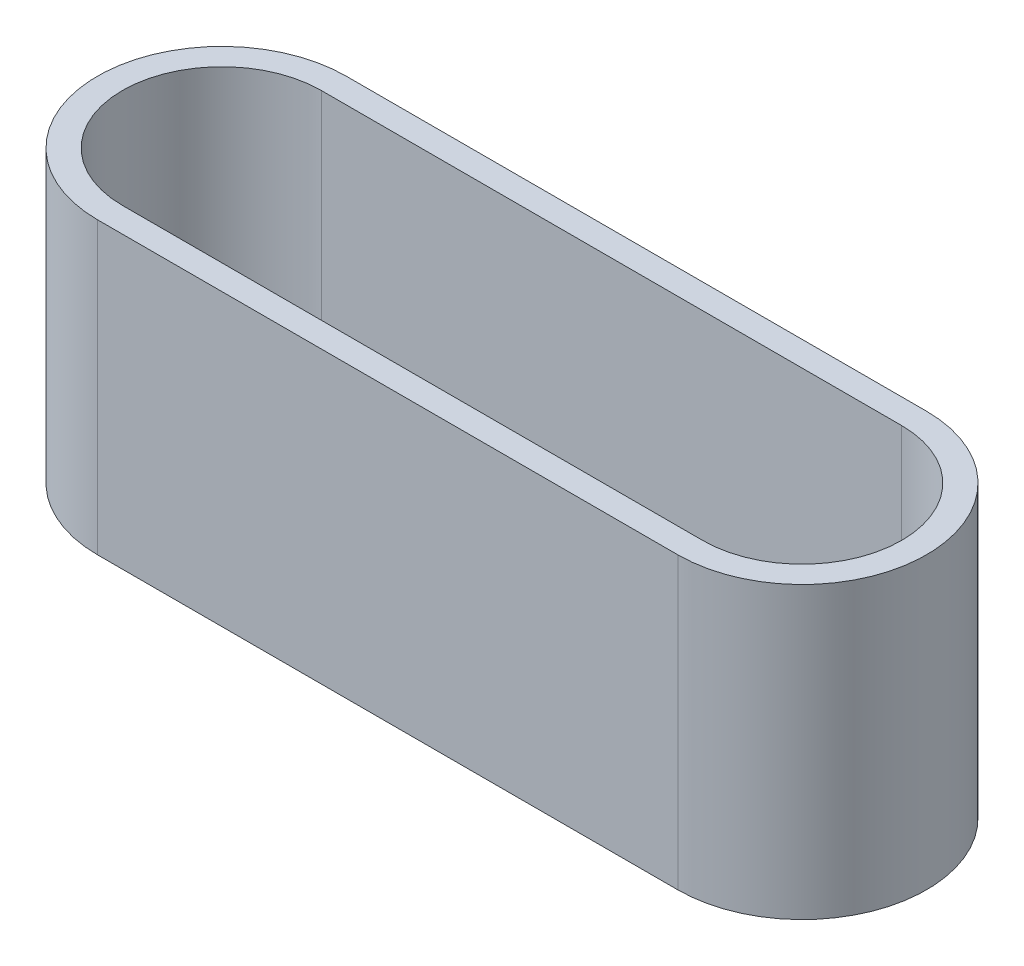
ISO-10303-21;
HEADER;
FILE_DESCRIPTION(('STEP AP214'),'2;1');
FILE_NAME('part.step','',(''),(''),'','','');
FILE_SCHEMA(('AUTOMOTIVE_DESIGN { 1 0 10303 214 1 1 1 1 }'));
ENDSEC;
DATA;
#1=APPLICATION_CONTEXT('core data for automotive mechanical design processes');
#2=APPLICATION_PROTOCOL_DEFINITION('international standard','automotive_design',2000,#1);
#3=PRODUCT_CONTEXT('',#1,'mechanical');
#4=PRODUCT('Part','Part','',(#3));
#5=PRODUCT_RELATED_PRODUCT_CATEGORY('part','',(#4));
#6=PRODUCT_DEFINITION_FORMATION('','',#4);
#7=PRODUCT_DEFINITION_CONTEXT('part definition',#1,'design');
#8=PRODUCT_DEFINITION('design','',#6,#7);
#9=PRODUCT_DEFINITION_SHAPE('','',#8);
#10=(LENGTH_UNIT() NAMED_UNIT(*) SI_UNIT(.MILLI.,.METRE.));
#11=(NAMED_UNIT(*) PLANE_ANGLE_UNIT() SI_UNIT($,.RADIAN.));
#12=(NAMED_UNIT(*) SI_UNIT($,.STERADIAN.) SOLID_ANGLE_UNIT());
#13=UNCERTAINTY_MEASURE_WITH_UNIT(LENGTH_MEASURE(1.E-05),#10,'distance_accuracy_value','');
#14=(GEOMETRIC_REPRESENTATION_CONTEXT(3) GLOBAL_UNCERTAINTY_ASSIGNED_CONTEXT((#13)) GLOBAL_UNIT_ASSIGNED_CONTEXT((#10,
#11,#12)) REPRESENTATION_CONTEXT('',''));
#15=CARTESIAN_POINT('',(0.,0.,0.));
#16=DIRECTION('',(0.,0.,1.));
#17=DIRECTION('',(1.,0.,0.));
#18=AXIS2_PLACEMENT_3D('',#15,#16,#17);
#19=CARTESIAN_POINT('',(-35.,35.,0.));
#20=DIRECTION('',(0.,1.,0.));
#21=DIRECTION('',(0.,0.,1.));
#22=AXIS2_PLACEMENT_3D('',#19,#20,#21);
#23=PLANE('',#22);
#24=CARTESIAN_POINT('',(-35.,35.,0.));
#25=DIRECTION('',(0.,1.,0.));
#26=DIRECTION('',(0.,0.,1.));
#27=AXIS2_PLACEMENT_3D('',#24,#25,#26);
#28=CIRCLE('',#27,15.);
#29=CARTESIAN_POINT('',(-35.,35.,-15.));
#30=VERTEX_POINT('',#29);
#31=CARTESIAN_POINT('',(-35.,35.,15.));
#32=VERTEX_POINT('',#31);
#33=EDGE_CURVE('E133',#30,#32,#28,.T.);
#34=ORIENTED_EDGE('',*,*,#33,.T.);
#35=DIRECTION('',(1.,0.,0.));
#36=VECTOR('',#35,1.);
#37=CARTESIAN_POINT('',(-35.,35.,15.));
#38=LINE('',#37,#36);
#39=CARTESIAN_POINT('',(35.,35.,15.));
#40=VERTEX_POINT('',#39);
#41=EDGE_CURVE('E136',#32,#40,#38,.T.);
#42=ORIENTED_EDGE('',*,*,#41,.T.);
#43=CARTESIAN_POINT('',(35.,35.,0.));
#44=DIRECTION('',(0.,1.,0.));
#45=DIRECTION('',(0.,0.,1.));
#46=AXIS2_PLACEMENT_3D('',#43,#44,#45);
#47=CIRCLE('',#46,15.);
#48=CARTESIAN_POINT('',(35.,35.,-15.));
#49=VERTEX_POINT('',#48);
#50=EDGE_CURVE('E139',#40,#49,#47,.T.);
#51=ORIENTED_EDGE('',*,*,#50,.T.);
#52=DIRECTION('',(-1.,0.,0.));
#53=VECTOR('',#52,1.);
#54=CARTESIAN_POINT('',(-35.,35.,-15.));
#55=LINE('',#54,#53);
#56=EDGE_CURVE('E141',#49,#30,#55,.T.);
#57=ORIENTED_EDGE('',*,*,#56,.T.);
#58=EDGE_LOOP('',(#34,#42,#51,#57));
#59=FACE_BOUND('',#58,.T.);
#60=DIRECTION('',(1.,0.,0.));
#61=VECTOR('',#60,1.);
#62=CARTESIAN_POINT('',(-35.,35.,12.));
#63=LINE('',#62,#61);
#64=CARTESIAN_POINT('',(-35.,35.,12.));
#65=VERTEX_POINT('',#64);
#66=CARTESIAN_POINT('',(35.,35.,12.));
#67=VERTEX_POINT('',#66);
#68=EDGE_CURVE('E105',#65,#67,#63,.T.);
#69=ORIENTED_EDGE('',*,*,#68,.F.);
#70=CARTESIAN_POINT('',(-35.,35.,0.));
#71=DIRECTION('',(0.,1.,0.));
#72=DIRECTION('',(0.,0.,1.));
#73=AXIS2_PLACEMENT_3D('',#70,#71,#72);
#74=CIRCLE('',#73,12.);
#75=CARTESIAN_POINT('',(-35.,35.,-12.));
#76=VERTEX_POINT('',#75);
#77=EDGE_CURVE('E97',#76,#65,#74,.T.);
#78=ORIENTED_EDGE('',*,*,#77,.F.);
#79=DIRECTION('',(-1.,0.,0.));
#80=VECTOR('',#79,1.);
#81=CARTESIAN_POINT('',(-35.,35.,-12.));
#82=LINE('',#81,#80);
#83=CARTESIAN_POINT('',(35.,35.,-12.));
#84=VERTEX_POINT('',#83);
#85=EDGE_CURVE('E119',#84,#76,#82,.T.);
#86=ORIENTED_EDGE('',*,*,#85,.F.);
#87=CARTESIAN_POINT('',(35.,35.,0.));
#88=DIRECTION('',(0.,1.,0.));
#89=DIRECTION('',(0.,0.,1.));
#90=AXIS2_PLACEMENT_3D('',#87,#88,#89);
#91=CIRCLE('',#90,12.);
#92=EDGE_CURVE('E117',#67,#84,#91,.T.);
#93=ORIENTED_EDGE('',*,*,#92,.F.);
#94=EDGE_LOOP('',(#69,#78,#86,#93));
#95=FACE_BOUND('',#94,.T.);
#96=ADVANCED_FACE('F32',(#59,#95),#23,.T.);
#97=CARTESIAN_POINT('',(-35.,0.,0.));
#98=DIRECTION('',(0.,1.,0.));
#99=DIRECTION('',(0.,0.,1.));
#100=AXIS2_PLACEMENT_3D('',#97,#98,#99);
#101=PLANE('',#100);
#102=CARTESIAN_POINT('',(-35.,0.,0.));
#103=DIRECTION('',(0.,1.,0.));
#104=DIRECTION('',(0.,0.,1.));
#105=AXIS2_PLACEMENT_3D('',#102,#103,#104);
#106=CIRCLE('',#105,15.);
#107=CARTESIAN_POINT('',(-35.,0.,-15.));
#108=VERTEX_POINT('',#107);
#109=CARTESIAN_POINT('',(-35.,0.,15.));
#110=VERTEX_POINT('',#109);
#111=EDGE_CURVE('E113',#108,#110,#106,.T.);
#112=ORIENTED_EDGE('',*,*,#111,.F.);
#113=DIRECTION('',(-1.,0.,0.));
#114=VECTOR('',#113,1.);
#115=CARTESIAN_POINT('',(-35.,0.,-15.));
#116=LINE('',#115,#114);
#117=CARTESIAN_POINT('',(35.,0.,-15.));
#118=VERTEX_POINT('',#117);
#119=EDGE_CURVE('E137',#118,#108,#116,.T.);
#120=ORIENTED_EDGE('',*,*,#119,.F.);
#121=CARTESIAN_POINT('',(35.,0.,0.));
#122=DIRECTION('',(0.,1.,0.));
#123=DIRECTION('',(0.,0.,1.));
#124=AXIS2_PLACEMENT_3D('',#121,#122,#123);
#125=CIRCLE('',#124,15.);
#126=CARTESIAN_POINT('',(35.,0.,15.));
#127=VERTEX_POINT('',#126);
#128=EDGE_CURVE('E148',#127,#118,#125,.T.);
#129=ORIENTED_EDGE('',*,*,#128,.F.);
#130=DIRECTION('',(1.,0.,0.));
#131=VECTOR('',#130,1.);
#132=CARTESIAN_POINT('',(-35.,0.,15.));
#133=LINE('',#132,#131);
#134=EDGE_CURVE('E146',#110,#127,#133,.T.);
#135=ORIENTED_EDGE('',*,*,#134,.F.);
#136=EDGE_LOOP('',(#112,#120,#129,#135));
#137=FACE_BOUND('',#136,.T.);
#138=CARTESIAN_POINT('',(-35.,0.,0.));
#139=DIRECTION('',(0.,1.,0.));
#140=DIRECTION('',(0.,0.,1.));
#141=AXIS2_PLACEMENT_3D('',#138,#139,#140);
#142=CIRCLE('',#141,12.);
#143=CARTESIAN_POINT('',(-35.,0.,-12.));
#144=VERTEX_POINT('',#143);
#145=CARTESIAN_POINT('',(-35.,0.,12.));
#146=VERTEX_POINT('',#145);
#147=EDGE_CURVE('E55',#144,#146,#142,.T.);
#148=ORIENTED_EDGE('',*,*,#147,.T.);
#149=DIRECTION('',(1.,0.,0.));
#150=VECTOR('',#149,1.);
#151=CARTESIAN_POINT('',(-35.,0.,12.));
#152=LINE('',#151,#150);
#153=CARTESIAN_POINT('',(35.,0.,12.));
#154=VERTEX_POINT('',#153);
#155=EDGE_CURVE('E112',#146,#154,#152,.T.);
#156=ORIENTED_EDGE('',*,*,#155,.T.);
#157=CARTESIAN_POINT('',(35.,0.,0.));
#158=DIRECTION('',(0.,1.,0.));
#159=DIRECTION('',(0.,0.,1.));
#160=AXIS2_PLACEMENT_3D('',#157,#158,#159);
#161=CIRCLE('',#160,12.);
#162=CARTESIAN_POINT('',(35.,0.,-12.));
#163=VERTEX_POINT('',#162);
#164=EDGE_CURVE('E125',#154,#163,#161,.T.);
#165=ORIENTED_EDGE('',*,*,#164,.T.);
#166=DIRECTION('',(-1.,0.,0.));
#167=VECTOR('',#166,1.);
#168=CARTESIAN_POINT('',(-35.,0.,-12.));
#169=LINE('',#168,#167);
#170=EDGE_CURVE('E106',#163,#144,#169,.T.);
#171=ORIENTED_EDGE('',*,*,#170,.T.);
#172=EDGE_LOOP('',(#148,#156,#165,#171));
#173=FACE_BOUND('',#172,.T.);
#174=ADVANCED_FACE('F166',(#137,#173),#101,.F.);
#175=CARTESIAN_POINT('',(-35.,35.,0.));
#176=DIRECTION('',(0.,-1.,0.));
#177=DIRECTION('',(0.,0.,-1.));
#178=AXIS2_PLACEMENT_3D('',#175,#176,#177);
#179=CYLINDRICAL_SURFACE('',#178,15.);
#180=ORIENTED_EDGE('',*,*,#111,.T.);
#181=DIRECTION('',(0.,-1.,0.));
#182=VECTOR('',#181,1.);
#183=CARTESIAN_POINT('',(-35.,35.,15.));
#184=LINE('',#183,#182);
#185=EDGE_CURVE('E11',#32,#110,#184,.T.);
#186=ORIENTED_EDGE('',*,*,#185,.F.);
#187=ORIENTED_EDGE('',*,*,#33,.F.);
#188=DIRECTION('',(0.,-1.,0.));
#189=VECTOR('',#188,1.);
#190=CARTESIAN_POINT('',(-35.,35.,-15.));
#191=LINE('',#190,#189);
#192=EDGE_CURVE('E143',#30,#108,#191,.T.);
#193=ORIENTED_EDGE('',*,*,#192,.T.);
#194=EDGE_LOOP('',(#180,#186,#187,#193));
#195=FACE_BOUND('',#194,.T.);
#196=ADVANCED_FACE('F34',(#195),#179,.T.);
#197=CARTESIAN_POINT('',(-35.,35.,15.));
#198=DIRECTION('',(0.,0.,-1.));
#199=DIRECTION('',(-1.,0.,0.));
#200=AXIS2_PLACEMENT_3D('',#197,#198,#199);
#201=PLANE('',#200);
#202=ORIENTED_EDGE('',*,*,#134,.T.);
#203=DIRECTION('',(0.,-1.,0.));
#204=VECTOR('',#203,1.);
#205=CARTESIAN_POINT('',(35.,35.,15.));
#206=LINE('',#205,#204);
#207=EDGE_CURVE('E40',#40,#127,#206,.T.);
#208=ORIENTED_EDGE('',*,*,#207,.F.);
#209=ORIENTED_EDGE('',*,*,#41,.F.);
#210=ORIENTED_EDGE('',*,*,#185,.T.);
#211=EDGE_LOOP('',(#202,#208,#209,#210));
#212=FACE_BOUND('',#211,.T.);
#213=ADVANCED_FACE('F176',(#212),#201,.F.);
#214=CARTESIAN_POINT('',(35.,35.,0.));
#215=DIRECTION('',(0.,-1.,0.));
#216=DIRECTION('',(0.,0.,-1.));
#217=AXIS2_PLACEMENT_3D('',#214,#215,#216);
#218=CYLINDRICAL_SURFACE('',#217,15.);
#219=ORIENTED_EDGE('',*,*,#128,.T.);
#220=DIRECTION('',(0.,-1.,0.));
#221=VECTOR('',#220,1.);
#222=CARTESIAN_POINT('',(35.,35.,-15.));
#223=LINE('',#222,#221);
#224=EDGE_CURVE('E153',#49,#118,#223,.T.);
#225=ORIENTED_EDGE('',*,*,#224,.F.);
#226=ORIENTED_EDGE('',*,*,#50,.F.);
#227=ORIENTED_EDGE('',*,*,#207,.T.);
#228=EDGE_LOOP('',(#219,#225,#226,#227));
#229=FACE_BOUND('',#228,.T.);
#230=ADVANCED_FACE('F160',(#229),#218,.T.);
#231=CARTESIAN_POINT('',(-35.,35.,-15.));
#232=DIRECTION('',(0.,0.,1.));
#233=DIRECTION('',(1.,0.,0.));
#234=AXIS2_PLACEMENT_3D('',#231,#232,#233);
#235=PLANE('',#234);
#236=ORIENTED_EDGE('',*,*,#119,.T.);
#237=ORIENTED_EDGE('',*,*,#192,.F.);
#238=ORIENTED_EDGE('',*,*,#56,.F.);
#239=ORIENTED_EDGE('',*,*,#224,.T.);
#240=EDGE_LOOP('',(#236,#237,#238,#239));
#241=FACE_BOUND('',#240,.T.);
#242=ADVANCED_FACE('F170',(#241),#235,.F.);
#243=CARTESIAN_POINT('',(-35.,35.,0.));
#244=DIRECTION('',(0.,-1.,0.));
#245=DIRECTION('',(0.,0.,-1.));
#246=AXIS2_PLACEMENT_3D('',#243,#244,#245);
#247=CYLINDRICAL_SURFACE('',#246,12.);
#248=ORIENTED_EDGE('',*,*,#147,.F.);
#249=DIRECTION('',(0.,-1.,0.));
#250=VECTOR('',#249,1.);
#251=CARTESIAN_POINT('',(-35.,35.,-12.));
#252=LINE('',#251,#250);
#253=EDGE_CURVE('E101',#76,#144,#252,.T.);
#254=ORIENTED_EDGE('',*,*,#253,.F.);
#255=ORIENTED_EDGE('',*,*,#77,.T.);
#256=DIRECTION('',(0.,-1.,0.));
#257=VECTOR('',#256,1.);
#258=CARTESIAN_POINT('',(-35.,35.,12.));
#259=LINE('',#258,#257);
#260=EDGE_CURVE('E100',#65,#146,#259,.T.);
#261=ORIENTED_EDGE('',*,*,#260,.T.);
#262=EDGE_LOOP('',(#248,#254,#255,#261));
#263=FACE_BOUND('',#262,.T.);
#264=ADVANCED_FACE('F99',(#263),#247,.F.);
#265=CARTESIAN_POINT('',(-35.,35.,12.));
#266=DIRECTION('',(0.,0.,-1.));
#267=DIRECTION('',(-1.,0.,0.));
#268=AXIS2_PLACEMENT_3D('',#265,#266,#267);
#269=PLANE('',#268);
#270=ORIENTED_EDGE('',*,*,#155,.F.);
#271=ORIENTED_EDGE('',*,*,#260,.F.);
#272=ORIENTED_EDGE('',*,*,#68,.T.);
#273=DIRECTION('',(0.,-1.,0.));
#274=VECTOR('',#273,1.);
#275=CARTESIAN_POINT('',(35.,35.,12.));
#276=LINE('',#275,#274);
#277=EDGE_CURVE('E114',#67,#154,#276,.T.);
#278=ORIENTED_EDGE('',*,*,#277,.T.);
#279=EDGE_LOOP('',(#270,#271,#272,#278));
#280=FACE_BOUND('',#279,.T.);
#281=ADVANCED_FACE('F109',(#280),#269,.T.);
#282=CARTESIAN_POINT('',(35.,35.,0.));
#283=DIRECTION('',(0.,-1.,0.));
#284=DIRECTION('',(0.,0.,-1.));
#285=AXIS2_PLACEMENT_3D('',#282,#283,#284);
#286=CYLINDRICAL_SURFACE('',#285,12.);
#287=ORIENTED_EDGE('',*,*,#164,.F.);
#288=ORIENTED_EDGE('',*,*,#277,.F.);
#289=ORIENTED_EDGE('',*,*,#92,.T.);
#290=DIRECTION('',(0.,-1.,0.));
#291=VECTOR('',#290,1.);
#292=CARTESIAN_POINT('',(35.,35.,-12.));
#293=LINE('',#292,#291);
#294=EDGE_CURVE('E47',#84,#163,#293,.T.);
#295=ORIENTED_EDGE('',*,*,#294,.T.);
#296=EDGE_LOOP('',(#287,#288,#289,#295));
#297=FACE_BOUND('',#296,.T.);
#298=ADVANCED_FACE('F199',(#297),#286,.F.);
#299=CARTESIAN_POINT('',(-35.,35.,-12.));
#300=DIRECTION('',(0.,0.,1.));
#301=DIRECTION('',(1.,0.,0.));
#302=AXIS2_PLACEMENT_3D('',#299,#300,#301);
#303=PLANE('',#302);
#304=ORIENTED_EDGE('',*,*,#170,.F.);
#305=ORIENTED_EDGE('',*,*,#294,.F.);
#306=ORIENTED_EDGE('',*,*,#85,.T.);
#307=ORIENTED_EDGE('',*,*,#253,.T.);
#308=EDGE_LOOP('',(#304,#305,#306,#307));
#309=FACE_BOUND('',#308,.T.);
#310=ADVANCED_FACE('F203',(#309),#303,.T.);
#311=CLOSED_SHELL('',(#96,#174,#196,#213,#230,#242,#264,#281,#298,#310));
#312=MANIFOLD_SOLID_BREP('B2',#311);
#313=ADVANCED_BREP_SHAPE_REPRESENTATION('',(#18,#312),#14);
#314=SHAPE_DEFINITION_REPRESENTATION(#9,#313);
ENDSEC;
END-ISO-10303-21;
